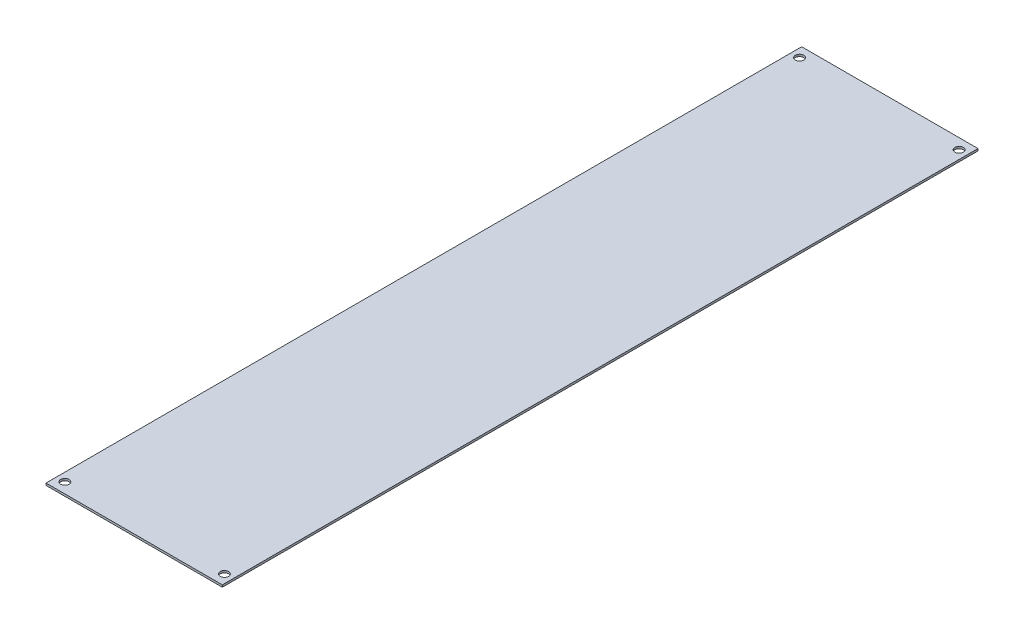
ISO-10303-21;
HEADER;
FILE_DESCRIPTION(('STEP AP214'),'2;1');
FILE_NAME('part.step','',(''),(''),'','','');
FILE_SCHEMA(('AUTOMOTIVE_DESIGN { 1 0 10303 214 1 1 1 1 }'));
ENDSEC;
DATA;
#1=APPLICATION_CONTEXT('core data for automotive mechanical design processes');
#2=APPLICATION_PROTOCOL_DEFINITION('international standard','automotive_design',2000,#1);
#3=PRODUCT_CONTEXT('',#1,'mechanical');
#4=PRODUCT('Part','Part','',(#3));
#5=PRODUCT_RELATED_PRODUCT_CATEGORY('part','',(#4));
#6=PRODUCT_DEFINITION_FORMATION('','',#4);
#7=PRODUCT_DEFINITION_CONTEXT('part definition',#1,'design');
#8=PRODUCT_DEFINITION('design','',#6,#7);
#9=PRODUCT_DEFINITION_SHAPE('','',#8);
#10=(LENGTH_UNIT() NAMED_UNIT(*) SI_UNIT(.MILLI.,.METRE.));
#11=(NAMED_UNIT(*) PLANE_ANGLE_UNIT() SI_UNIT($,.RADIAN.));
#12=(NAMED_UNIT(*) SI_UNIT($,.STERADIAN.) SOLID_ANGLE_UNIT());
#13=UNCERTAINTY_MEASURE_WITH_UNIT(LENGTH_MEASURE(1.E-05),#10,'distance_accuracy_value','');
#14=(GEOMETRIC_REPRESENTATION_CONTEXT(3) GLOBAL_UNCERTAINTY_ASSIGNED_CONTEXT((#13)) GLOBAL_UNIT_ASSIGNED_CONTEXT((#10,
#11,#12)) REPRESENTATION_CONTEXT('',''));
#15=CARTESIAN_POINT('',(0.,0.,0.));
#16=DIRECTION('',(0.,0.,1.));
#17=DIRECTION('',(1.,0.,0.));
#18=AXIS2_PLACEMENT_3D('',#15,#16,#17);
#19=CARTESIAN_POINT('',(0.,0.,0.));
#20=DIRECTION('',(0.,1.,0.));
#21=DIRECTION('',(1.,0.,0.));
#22=AXIS2_PLACEMENT_3D('',#19,#20,#21);
#23=PLANE('',#22);
#24=CARTESIAN_POINT('',(38.,0.,175.));
#25=DIRECTION('',(0.,1.,0.));
#26=DIRECTION('',(1.,0.,0.));
#27=AXIS2_PLACEMENT_3D('',#24,#25,#26);
#28=CIRCLE('',#27,2.);
#29=CARTESIAN_POINT('',(36.,0.,175.));
#30=VERTEX_POINT('',#29);
#31=EDGE_CURVE('E144',#30,#30,#28,.T.);
#32=ORIENTED_EDGE('',*,*,#31,.T.);
#33=EDGE_LOOP('',(#32));
#34=FACE_BOUND('',#33,.T.);
#35=CARTESIAN_POINT('',(-38.,0.,-175.));
#36=DIRECTION('',(0.,1.,0.));
#37=DIRECTION('',(1.,0.,0.));
#38=AXIS2_PLACEMENT_3D('',#35,#36,#37);
#39=CIRCLE('',#38,2.);
#40=CARTESIAN_POINT('',(-40.,0.,-175.));
#41=VERTEX_POINT('',#40);
#42=EDGE_CURVE('E71',#41,#41,#39,.T.);
#43=ORIENTED_EDGE('',*,*,#42,.T.);
#44=EDGE_LOOP('',(#43));
#45=FACE_BOUND('',#44,.T.);
#46=CARTESIAN_POINT('',(-38.,0.,175.));
#47=DIRECTION('',(0.,1.,0.));
#48=DIRECTION('',(1.,0.,0.));
#49=AXIS2_PLACEMENT_3D('',#46,#47,#48);
#50=CIRCLE('',#49,2.);
#51=CARTESIAN_POINT('',(-40.,0.,175.));
#52=VERTEX_POINT('',#51);
#53=EDGE_CURVE('E173',#52,#52,#50,.T.);
#54=ORIENTED_EDGE('',*,*,#53,.T.);
#55=EDGE_LOOP('',(#54));
#56=FACE_BOUND('',#55,.T.);
#57=CARTESIAN_POINT('',(38.,0.,-175.));
#58=DIRECTION('',(0.,1.,0.));
#59=DIRECTION('',(1.,0.,0.));
#60=AXIS2_PLACEMENT_3D('',#57,#58,#59);
#61=CIRCLE('',#60,2.);
#62=CARTESIAN_POINT('',(36.,0.,-175.));
#63=VERTEX_POINT('',#62);
#64=EDGE_CURVE('E131',#63,#63,#61,.T.);
#65=ORIENTED_EDGE('',*,*,#64,.T.);
#66=EDGE_LOOP('',(#65));
#67=FACE_BOUND('',#66,.T.);
#68=DIRECTION('',(0.,0.,1.));
#69=VECTOR('',#68,1.);
#70=CARTESIAN_POINT('',(-42.,0.,-180.));
#71=LINE('',#70,#69);
#72=CARTESIAN_POINT('',(-42.,0.,-180.));
#73=VERTEX_POINT('',#72);
#74=CARTESIAN_POINT('',(-42.,0.,180.));
#75=VERTEX_POINT('',#74);
#76=EDGE_CURVE('E27',#73,#75,#71,.T.);
#77=ORIENTED_EDGE('',*,*,#76,.F.);
#78=DIRECTION('',(-1.,0.,0.));
#79=VECTOR('',#78,1.);
#80=CARTESIAN_POINT('',(42.,0.,-180.));
#81=LINE('',#80,#79);
#82=CARTESIAN_POINT('',(42.,0.,-180.));
#83=VERTEX_POINT('',#82);
#84=EDGE_CURVE('E146',#83,#73,#81,.T.);
#85=ORIENTED_EDGE('',*,*,#84,.F.);
#86=DIRECTION('',(0.,0.,-1.));
#87=VECTOR('',#86,1.);
#88=CARTESIAN_POINT('',(42.,0.,180.));
#89=LINE('',#88,#87);
#90=CARTESIAN_POINT('',(42.,0.,180.));
#91=VERTEX_POINT('',#90);
#92=EDGE_CURVE('E149',#91,#83,#89,.T.);
#93=ORIENTED_EDGE('',*,*,#92,.F.);
#94=DIRECTION('',(1.,0.,0.));
#95=VECTOR('',#94,1.);
#96=CARTESIAN_POINT('',(-42.,0.,180.));
#97=LINE('',#96,#95);
#98=EDGE_CURVE('E98',#75,#91,#97,.T.);
#99=ORIENTED_EDGE('',*,*,#98,.F.);
#100=EDGE_LOOP('',(#77,#85,#93,#99));
#101=FACE_BOUND('',#100,.T.);
#102=ADVANCED_FACE('F17',(#34,#45,#56,#67,#101),#23,.F.);
#103=CARTESIAN_POINT('',(0.,1.,0.));
#104=DIRECTION('',(0.,1.,0.));
#105=DIRECTION('',(1.,0.,0.));
#106=AXIS2_PLACEMENT_3D('',#103,#104,#105);
#107=PLANE('',#106);
#108=CARTESIAN_POINT('',(38.,1.,175.));
#109=DIRECTION('',(0.,-1.,0.));
#110=DIRECTION('',(1.,0.,0.));
#111=AXIS2_PLACEMENT_3D('',#108,#109,#110);
#112=CIRCLE('',#111,2.);
#113=CARTESIAN_POINT('',(36.,1.,175.));
#114=VERTEX_POINT('',#113);
#115=EDGE_CURVE('E158',#114,#114,#112,.T.);
#116=ORIENTED_EDGE('',*,*,#115,.T.);
#117=EDGE_LOOP('',(#116));
#118=FACE_BOUND('',#117,.T.);
#119=CARTESIAN_POINT('',(-38.,1.,-175.));
#120=DIRECTION('',(0.,-1.,0.));
#121=DIRECTION('',(1.,0.,0.));
#122=AXIS2_PLACEMENT_3D('',#119,#120,#121);
#123=CIRCLE('',#122,2.);
#124=CARTESIAN_POINT('',(-40.,1.,-175.));
#125=VERTEX_POINT('',#124);
#126=EDGE_CURVE('E155',#125,#125,#123,.T.);
#127=ORIENTED_EDGE('',*,*,#126,.T.);
#128=EDGE_LOOP('',(#127));
#129=FACE_BOUND('',#128,.T.);
#130=CARTESIAN_POINT('',(-38.,1.,175.));
#131=DIRECTION('',(0.,-1.,0.));
#132=DIRECTION('',(1.,0.,0.));
#133=AXIS2_PLACEMENT_3D('',#130,#131,#132);
#134=CIRCLE('',#133,2.);
#135=CARTESIAN_POINT('',(-40.,1.,175.));
#136=VERTEX_POINT('',#135);
#137=EDGE_CURVE('E143',#136,#136,#134,.T.);
#138=ORIENTED_EDGE('',*,*,#137,.T.);
#139=EDGE_LOOP('',(#138));
#140=FACE_BOUND('',#139,.T.);
#141=CARTESIAN_POINT('',(38.,1.,-175.));
#142=DIRECTION('',(0.,-1.,0.));
#143=DIRECTION('',(1.,0.,0.));
#144=AXIS2_PLACEMENT_3D('',#141,#142,#143);
#145=CIRCLE('',#144,2.);
#146=CARTESIAN_POINT('',(36.,1.,-175.));
#147=VERTEX_POINT('',#146);
#148=EDGE_CURVE('E130',#147,#147,#145,.T.);
#149=ORIENTED_EDGE('',*,*,#148,.T.);
#150=EDGE_LOOP('',(#149));
#151=FACE_BOUND('',#150,.T.);
#152=DIRECTION('',(0.,0.,1.));
#153=VECTOR('',#152,1.);
#154=CARTESIAN_POINT('',(-42.,1.,-180.));
#155=LINE('',#154,#153);
#156=CARTESIAN_POINT('',(-42.,1.,-180.));
#157=VERTEX_POINT('',#156);
#158=CARTESIAN_POINT('',(-42.,1.,180.));
#159=VERTEX_POINT('',#158);
#160=EDGE_CURVE('E11',#157,#159,#155,.T.);
#161=ORIENTED_EDGE('',*,*,#160,.T.);
#162=DIRECTION('',(1.,0.,0.));
#163=VECTOR('',#162,1.);
#164=CARTESIAN_POINT('',(-42.,1.,180.));
#165=LINE('',#164,#163);
#166=CARTESIAN_POINT('',(42.,1.,180.));
#167=VERTEX_POINT('',#166);
#168=EDGE_CURVE('E90',#159,#167,#165,.T.);
#169=ORIENTED_EDGE('',*,*,#168,.T.);
#170=DIRECTION('',(0.,0.,-1.));
#171=VECTOR('',#170,1.);
#172=CARTESIAN_POINT('',(42.,1.,180.));
#173=LINE('',#172,#171);
#174=CARTESIAN_POINT('',(42.,1.,-180.));
#175=VERTEX_POINT('',#174);
#176=EDGE_CURVE('E104',#167,#175,#173,.T.);
#177=ORIENTED_EDGE('',*,*,#176,.T.);
#178=DIRECTION('',(-1.,0.,0.));
#179=VECTOR('',#178,1.);
#180=CARTESIAN_POINT('',(42.,1.,-180.));
#181=LINE('',#180,#179);
#182=EDGE_CURVE('E162',#175,#157,#181,.T.);
#183=ORIENTED_EDGE('',*,*,#182,.T.);
#184=EDGE_LOOP('',(#161,#169,#177,#183));
#185=FACE_BOUND('',#184,.T.);
#186=ADVANCED_FACE('F135',(#118,#129,#140,#151,#185),#107,.T.);
#187=CARTESIAN_POINT('',(-42.,0.,-180.));
#188=DIRECTION('',(-1.,0.,0.));
#189=DIRECTION('',(0.,0.,1.));
#190=AXIS2_PLACEMENT_3D('',#187,#188,#189);
#191=PLANE('',#190);
#192=ORIENTED_EDGE('',*,*,#76,.T.);
#193=DIRECTION('',(0.,1.,0.));
#194=VECTOR('',#193,1.);
#195=CARTESIAN_POINT('',(-42.,0.,180.));
#196=LINE('',#195,#194);
#197=EDGE_CURVE('E182',#75,#159,#196,.T.);
#198=ORIENTED_EDGE('',*,*,#197,.T.);
#199=ORIENTED_EDGE('',*,*,#160,.F.);
#200=DIRECTION('',(0.,1.,0.));
#201=VECTOR('',#200,1.);
#202=CARTESIAN_POINT('',(-42.,0.,-180.));
#203=LINE('',#202,#201);
#204=EDGE_CURVE('E168',#73,#157,#203,.T.);
#205=ORIENTED_EDGE('',*,*,#204,.F.);
#206=EDGE_LOOP('',(#192,#198,#199,#205));
#207=FACE_BOUND('',#206,.T.);
#208=ADVANCED_FACE('F210',(#207),#191,.T.);
#209=CARTESIAN_POINT('',(-42.,0.,180.));
#210=DIRECTION('',(0.,0.,1.));
#211=DIRECTION('',(1.,0.,0.));
#212=AXIS2_PLACEMENT_3D('',#209,#210,#211);
#213=PLANE('',#212);
#214=ORIENTED_EDGE('',*,*,#98,.T.);
#215=DIRECTION('',(0.,1.,0.));
#216=VECTOR('',#215,1.);
#217=CARTESIAN_POINT('',(42.,0.,180.));
#218=LINE('',#217,#216);
#219=EDGE_CURVE('E148',#91,#167,#218,.T.);
#220=ORIENTED_EDGE('',*,*,#219,.T.);
#221=ORIENTED_EDGE('',*,*,#168,.F.);
#222=ORIENTED_EDGE('',*,*,#197,.F.);
#223=EDGE_LOOP('',(#214,#220,#221,#222));
#224=FACE_BOUND('',#223,.T.);
#225=ADVANCED_FACE('F200',(#224),#213,.T.);
#226=CARTESIAN_POINT('',(42.,0.,180.));
#227=DIRECTION('',(1.,0.,0.));
#228=DIRECTION('',(0.,0.,-1.));
#229=AXIS2_PLACEMENT_3D('',#226,#227,#228);
#230=PLANE('',#229);
#231=ORIENTED_EDGE('',*,*,#92,.T.);
#232=DIRECTION('',(0.,1.,0.));
#233=VECTOR('',#232,1.);
#234=CARTESIAN_POINT('',(42.,0.,-180.));
#235=LINE('',#234,#233);
#236=EDGE_CURVE('E159',#83,#175,#235,.T.);
#237=ORIENTED_EDGE('',*,*,#236,.T.);
#238=ORIENTED_EDGE('',*,*,#176,.F.);
#239=ORIENTED_EDGE('',*,*,#219,.F.);
#240=EDGE_LOOP('',(#231,#237,#238,#239));
#241=FACE_BOUND('',#240,.T.);
#242=ADVANCED_FACE('F203',(#241),#230,.T.);
#243=CARTESIAN_POINT('',(42.,0.,-180.));
#244=DIRECTION('',(0.,0.,-1.));
#245=DIRECTION('',(0.,-1.,0.));
#246=AXIS2_PLACEMENT_3D('',#243,#244,#245);
#247=PLANE('',#246);
#248=ORIENTED_EDGE('',*,*,#84,.T.);
#249=ORIENTED_EDGE('',*,*,#204,.T.);
#250=ORIENTED_EDGE('',*,*,#182,.F.);
#251=ORIENTED_EDGE('',*,*,#236,.F.);
#252=EDGE_LOOP('',(#248,#249,#250,#251));
#253=FACE_BOUND('',#252,.T.);
#254=ADVANCED_FACE('F208',(#253),#247,.T.);
#255=CARTESIAN_POINT('',(38.,-368.671475772746,175.));
#256=DIRECTION('',(0.,1.,0.));
#257=DIRECTION('',(1.,0.,0.));
#258=AXIS2_PLACEMENT_3D('',#255,#256,#257);
#259=CYLINDRICAL_SURFACE('',#258,2.);
#260=ORIENTED_EDGE('',*,*,#115,.F.);
#261=DIRECTION('',(0.,-1.,0.));
#262=VECTOR('',#261,1.);
#263=CARTESIAN_POINT('',(36.,-368.671475772746,175.));
#264=LINE('',#263,#262);
#265=EDGE_CURVE('E57',#114,#30,#264,.T.);
#266=ORIENTED_EDGE('',*,*,#265,.T.);
#267=ORIENTED_EDGE('',*,*,#31,.F.);
#268=ORIENTED_EDGE('',*,*,#265,.F.);
#269=EDGE_LOOP('',(#260,#266,#267,#268));
#270=FACE_BOUND('',#269,.T.);
#271=ADVANCED_FACE('F227',(#270),#259,.F.);
#272=CARTESIAN_POINT('',(-38.,-368.671475772746,-175.));
#273=DIRECTION('',(0.,1.,0.));
#274=DIRECTION('',(1.,0.,0.));
#275=AXIS2_PLACEMENT_3D('',#272,#273,#274);
#276=CYLINDRICAL_SURFACE('',#275,2.);
#277=ORIENTED_EDGE('',*,*,#126,.F.);
#278=DIRECTION('',(0.,-1.,0.));
#279=VECTOR('',#278,1.);
#280=CARTESIAN_POINT('',(-40.,-368.671475772746,-175.));
#281=LINE('',#280,#279);
#282=EDGE_CURVE('E151',#125,#41,#281,.T.);
#283=ORIENTED_EDGE('',*,*,#282,.T.);
#284=ORIENTED_EDGE('',*,*,#42,.F.);
#285=ORIENTED_EDGE('',*,*,#282,.F.);
#286=EDGE_LOOP('',(#277,#283,#284,#285));
#287=FACE_BOUND('',#286,.T.);
#288=ADVANCED_FACE('F229',(#287),#276,.F.);
#289=CARTESIAN_POINT('',(-38.,-368.671475772746,175.));
#290=DIRECTION('',(0.,1.,0.));
#291=DIRECTION('',(1.,0.,0.));
#292=AXIS2_PLACEMENT_3D('',#289,#290,#291);
#293=CYLINDRICAL_SURFACE('',#292,2.);
#294=ORIENTED_EDGE('',*,*,#137,.F.);
#295=DIRECTION('',(0.,-1.,0.));
#296=VECTOR('',#295,1.);
#297=CARTESIAN_POINT('',(-40.,-368.671475772746,175.));
#298=LINE('',#297,#296);
#299=EDGE_CURVE('E169',#136,#52,#298,.T.);
#300=ORIENTED_EDGE('',*,*,#299,.T.);
#301=ORIENTED_EDGE('',*,*,#53,.F.);
#302=ORIENTED_EDGE('',*,*,#299,.F.);
#303=EDGE_LOOP('',(#294,#300,#301,#302));
#304=FACE_BOUND('',#303,.T.);
#305=ADVANCED_FACE('F19',(#304),#293,.F.);
#306=CARTESIAN_POINT('',(38.,-368.671475772746,-175.));
#307=DIRECTION('',(0.,1.,0.));
#308=DIRECTION('',(1.,0.,0.));
#309=AXIS2_PLACEMENT_3D('',#306,#307,#308);
#310=CYLINDRICAL_SURFACE('',#309,2.);
#311=ORIENTED_EDGE('',*,*,#148,.F.);
#312=DIRECTION('',(0.,-1.,0.));
#313=VECTOR('',#312,1.);
#314=CARTESIAN_POINT('',(36.,-368.671475772746,-175.));
#315=LINE('',#314,#313);
#316=EDGE_CURVE('E127',#147,#63,#315,.T.);
#317=ORIENTED_EDGE('',*,*,#316,.T.);
#318=ORIENTED_EDGE('',*,*,#64,.F.);
#319=ORIENTED_EDGE('',*,*,#316,.F.);
#320=EDGE_LOOP('',(#311,#317,#318,#319));
#321=FACE_BOUND('',#320,.T.);
#322=ADVANCED_FACE('F129',(#321),#310,.F.);
#323=CLOSED_SHELL('',(#102,#186,#208,#225,#242,#254,#271,#288,#305,#322));
#324=MANIFOLD_SOLID_BREP('B1',#323);
#325=ADVANCED_BREP_SHAPE_REPRESENTATION('',(#18,#324),#14);
#326=SHAPE_DEFINITION_REPRESENTATION(#9,#325);
ENDSEC;
END-ISO-10303-21;
